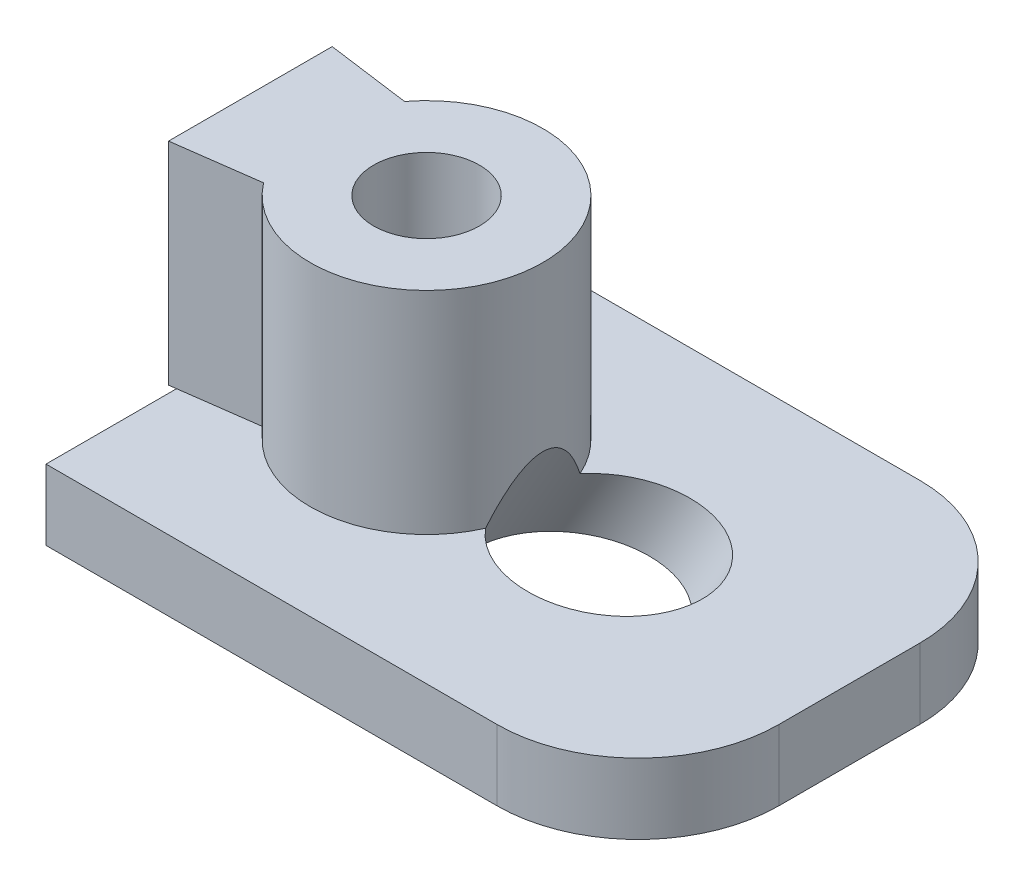
ISO-10303-21;
HEADER;
FILE_DESCRIPTION(('STEP AP214'),'2;1');
FILE_NAME('part.step','',(''),(''),'','','');
FILE_SCHEMA(('AUTOMOTIVE_DESIGN { 1 0 10303 214 1 1 1 1 }'));
ENDSEC;
DATA;
#1=APPLICATION_CONTEXT('core data for automotive mechanical design processes');
#2=APPLICATION_PROTOCOL_DEFINITION('international standard','automotive_design',2000,#1);
#3=PRODUCT_CONTEXT('',#1,'mechanical');
#4=PRODUCT('Part','Part','',(#3));
#5=PRODUCT_RELATED_PRODUCT_CATEGORY('part','',(#4));
#6=PRODUCT_DEFINITION_FORMATION('','',#4);
#7=PRODUCT_DEFINITION_CONTEXT('part definition',#1,'design');
#8=PRODUCT_DEFINITION('design','',#6,#7);
#9=PRODUCT_DEFINITION_SHAPE('','',#8);
#10=(LENGTH_UNIT() NAMED_UNIT(*) SI_UNIT(.MILLI.,.METRE.));
#11=(NAMED_UNIT(*) PLANE_ANGLE_UNIT() SI_UNIT($,.RADIAN.));
#12=(NAMED_UNIT(*) SI_UNIT($,.STERADIAN.) SOLID_ANGLE_UNIT());
#13=UNCERTAINTY_MEASURE_WITH_UNIT(LENGTH_MEASURE(1.E-05),#10,'distance_accuracy_value','');
#14=(GEOMETRIC_REPRESENTATION_CONTEXT(3) GLOBAL_UNCERTAINTY_ASSIGNED_CONTEXT((#13)) GLOBAL_UNIT_ASSIGNED_CONTEXT((#10,
#11,#12)) REPRESENTATION_CONTEXT('',''));
#15=CARTESIAN_POINT('',(0.,0.,0.));
#16=DIRECTION('',(0.,0.,1.));
#17=DIRECTION('',(1.,0.,0.));
#18=AXIS2_PLACEMENT_3D('',#15,#16,#17);
#19=CARTESIAN_POINT('',(2.5,7.75,0.));
#20=DIRECTION('',(0.,1.,0.));
#21=DIRECTION('',(0.,0.,1.));
#22=AXIS2_PLACEMENT_3D('',#19,#20,#21);
#23=PLANE('',#22);
#24=DIRECTION('',(0.,0.,-1.));
#25=VECTOR('',#24,1.);
#26=CARTESIAN_POINT('',(1.30000000001017,7.75,1.49999999996326));
#27=LINE('',#26,#25);
#28=CARTESIAN_POINT('',(1.30000000001017,7.75,0.573731658954848));
#29=VERTEX_POINT('',#28);
#30=CARTESIAN_POINT('',(1.30000000001017,7.75,-0.573731658954847));
#31=VERTEX_POINT('',#30);
#32=EDGE_CURVE('E48',#29,#31,#27,.T.);
#33=ORIENTED_EDGE('',*,*,#32,.F.);
#34=DIRECTION('',(0.990932376959291,0.,-0.134361543210135));
#35=VECTOR('',#34,1.);
#36=CARTESIAN_POINT('',(1.84377976257967,7.75,0.500000000000001));
#37=LINE('',#36,#35);
#38=CARTESIAN_POINT('',(1.25000000001017,7.75,0.580511210533455));
#39=VERTEX_POINT('',#38);
#40=EDGE_CURVE('E158',#39,#29,#37,.T.);
#41=ORIENTED_EDGE('',*,*,#40,.F.);
#42=DIRECTION('',(0.,0.,1.));
#43=VECTOR('',#42,1.);
#44=CARTESIAN_POINT('',(1.25000000001017,7.75,0.580511210533455));
#45=LINE('',#44,#43);
#46=CARTESIAN_POINT('',(1.25000000001017,7.75,-0.580511210533454));
#47=VERTEX_POINT('',#46);
#48=EDGE_CURVE('E155',#47,#39,#45,.T.);
#49=ORIENTED_EDGE('',*,*,#48,.F.);
#50=DIRECTION('',(-0.990932376959291,0.,-0.134361543210137));
#51=VECTOR('',#50,1.);
#52=CARTESIAN_POINT('',(1.25000000001017,7.75,-0.580511210533454));
#53=LINE('',#52,#51);
#54=EDGE_CURVE('E146',#31,#47,#53,.T.);
#55=ORIENTED_EDGE('',*,*,#54,.F.);
#56=EDGE_LOOP('',(#33,#41,#49,#55));
#57=FACE_BOUND('',#56,.T.);
#58=ADVANCED_FACE('F39',(#57),#23,.F.);
#59=CARTESIAN_POINT('',(2.5,9.25,0.));
#60=DIRECTION('',(0.,1.,0.));
#61=DIRECTION('',(0.,0.,1.));
#62=AXIS2_PLACEMENT_3D('',#59,#60,#61);
#63=PLANE('',#62);
#64=CARTESIAN_POINT('',(2.5,9.25,0.));
#65=DIRECTION('',(0.,1.,0.));
#66=DIRECTION('',(0.,0.,1.));
#67=AXIS2_PLACEMENT_3D('',#64,#65,#66);
#68=CIRCLE('',#67,0.824999999999999);
#69=CARTESIAN_POINT('',(1.84377976257967,9.25,0.500000000000001));
#70=VERTEX_POINT('',#69);
#71=CARTESIAN_POINT('',(1.84377976257967,9.25,-0.499999999999999));
#72=VERTEX_POINT('',#71);
#73=EDGE_CURVE('E160',#70,#72,#68,.T.);
#74=ORIENTED_EDGE('',*,*,#73,.T.);
#75=DIRECTION('',(-0.990932376959291,0.,-0.134361543210137));
#76=VECTOR('',#75,1.);
#77=CARTESIAN_POINT('',(1.25000000001017,9.25,-0.580511210533454));
#78=LINE('',#77,#76);
#79=CARTESIAN_POINT('',(1.25000000001017,9.25,-0.580511210533454));
#80=VERTEX_POINT('',#79);
#81=EDGE_CURVE('E295',#72,#80,#78,.T.);
#82=ORIENTED_EDGE('',*,*,#81,.T.);
#83=DIRECTION('',(0.,0.,1.));
#84=VECTOR('',#83,1.);
#85=CARTESIAN_POINT('',(1.25000000001017,9.25,0.580511210533455));
#86=LINE('',#85,#84);
#87=CARTESIAN_POINT('',(1.25000000001017,9.25,0.580511210533455));
#88=VERTEX_POINT('',#87);
#89=EDGE_CURVE('E296',#80,#88,#86,.T.);
#90=ORIENTED_EDGE('',*,*,#89,.T.);
#91=DIRECTION('',(0.990932376959291,0.,-0.134361543210135));
#92=VECTOR('',#91,1.);
#93=CARTESIAN_POINT('',(1.84377976257967,9.25,0.500000000000001));
#94=LINE('',#93,#92);
#95=EDGE_CURVE('E152',#88,#70,#94,.T.);
#96=ORIENTED_EDGE('',*,*,#95,.T.);
#97=EDGE_LOOP('',(#74,#82,#90,#96));
#98=FACE_BOUND('',#97,.T.);
#99=CARTESIAN_POINT('',(2.5,9.25,0.));
#100=DIRECTION('',(0.,1.,0.));
#101=DIRECTION('',(0.,0.,1.));
#102=AXIS2_PLACEMENT_3D('',#99,#100,#101);
#103=CIRCLE('',#102,0.374999999999997);
#104=CARTESIAN_POINT('',(2.5,9.25,0.374999999999998));
#105=VERTEX_POINT('',#104);
#106=EDGE_CURVE('E144',#105,#105,#103,.T.);
#107=ORIENTED_EDGE('',*,*,#106,.F.);
#108=EDGE_LOOP('',(#107));
#109=FACE_BOUND('',#108,.T.);
#110=ADVANCED_FACE('F246',(#98,#109),#63,.T.);
#111=CARTESIAN_POINT('',(2.5,9.25,0.));
#112=DIRECTION('',(0.,-1.,0.));
#113=DIRECTION('',(0.,0.,-1.));
#114=AXIS2_PLACEMENT_3D('',#111,#112,#113);
#115=CYLINDRICAL_SURFACE('',#114,0.824999999999999);
#116=CARTESIAN_POINT('',(2.5,7.75,0.));
#117=DIRECTION('',(0.,1.,0.));
#118=DIRECTION('',(0.,0.,1.));
#119=AXIS2_PLACEMENT_3D('',#116,#117,#118);
#120=CIRCLE('',#119,0.824999999999999);
#121=CARTESIAN_POINT('',(1.84377976257967,7.75,0.500000000000001));
#122=VERTEX_POINT('',#121);
#123=CARTESIAN_POINT('',(3.25386128245776,7.75,0.335139026093854));
#124=VERTEX_POINT('',#123);
#125=EDGE_CURVE('E137',#122,#124,#120,.T.);
#126=ORIENTED_EDGE('',*,*,#125,.T.);
#127=CARTESIAN_POINT('',(3.25386128245776,7.75,0.335139026093854));
#128=CARTESIAN_POINT('',(3.25811827945143,7.77111145134007,0.325541480594741));
#129=CARTESIAN_POINT('',(3.26237618985324,7.79203851414726,0.315490895272771));
#130=CARTESIAN_POINT('',(3.27087060163928,7.83346444112072,0.294143706094102));
#131=CARTESIAN_POINT('',(3.27510666885029,7.85395862240085,0.282837894462469));
#132=CARTESIAN_POINT('',(3.28365867745061,7.89504882720899,0.258226700738959));
#133=CARTESIAN_POINT('',(3.28796923505354,7.91560562627378,0.244852971195866));
#134=CARTESIAN_POINT('',(3.29633558540741,7.95525746882288,0.216100636082207));
#135=CARTESIAN_POINT('',(3.30039223893617,7.97435750521167,0.200729416591836));
#136=CARTESIAN_POINT('',(3.3068811786802,8.00475583811144,0.172365461038509));
#137=CARTESIAN_POINT('',(3.30943325103671,8.01666468819849,0.160062926805976));
#138=CARTESIAN_POINT('',(3.31415936947011,8.03865387144431,0.133955802069157));
#139=CARTESIAN_POINT('',(3.31633608493243,8.04874714052105,0.120163058618312));
#140=CARTESIAN_POINT('',(3.31949670108628,8.06337210909149,0.0956487923371603));
#141=CARTESIAN_POINT('',(3.32063801388451,8.06864369968799,0.0853948313894527));
#142=CARTESIAN_POINT('',(3.32257028030641,8.07755972822864,0.0641595159964622));
#143=CARTESIAN_POINT('',(3.32336147927492,8.0812053056277,0.0531786771391695));
#144=CARTESIAN_POINT('',(3.32451106354808,8.08649985099804,0.0305834067615675));
#145=CARTESIAN_POINT('',(3.32486475076176,8.08812714672857,0.0189634739441499));
#146=CARTESIAN_POINT('',(3.32507075738346,8.08907515740627,-0.00437514955612619));
#147=CARTESIAN_POINT('',(3.32492327601952,8.08839678891716,-0.0160937991488201));
#148=CARTESIAN_POINT('',(3.32420599420556,8.08509483171219,-0.0375262797973913));
#149=CARTESIAN_POINT('',(3.32369887705464,8.08275994627251,-0.0472892373627836));
#150=CARTESIAN_POINT('',(3.32238349803524,8.07669752546358,-0.0663453282431124));
#151=CARTESIAN_POINT('',(3.32157510025383,8.07296936156009,-0.0756382473634516));
#152=CARTESIAN_POINT('',(3.31915992515662,8.06181618546568,-0.0990567266198888));
#153=CARTESIAN_POINT('',(3.31736498722118,8.05351449699766,-0.112742182378179));
#154=CARTESIAN_POINT('',(3.3133685530943,8.03497759042128,-0.138670077205083));
#155=CARTESIAN_POINT('',(3.31116570433568,8.02473593703016,-0.15090748678667));
#156=CARTESIAN_POINT('',(3.30435312281886,7.9929546603496,-0.184834268167634));
#157=CARTESIAN_POINT('',(3.29939752035186,7.96970764985597,-0.204830208753251));
#158=CARTESIAN_POINT('',(3.28906892407751,7.92085898946442,-0.24157132260841));
#159=CARTESIAN_POINT('',(3.28369431237605,7.89524813437457,-0.258302923156063));
#160=CARTESIAN_POINT('',(3.27421193936738,7.84963382590647,-0.285248119484467));
#161=CARTESIAN_POINT('',(3.27014588007999,7.82994285917185,-0.296014031765552));
#162=CARTESIAN_POINT('',(3.26200673466994,7.79022219707945,-0.316365288634048));
#163=CARTESIAN_POINT('',(3.25793414959498,7.77019805751701,-0.325961622383703));
#164=CARTESIAN_POINT('',(3.25386128245776,7.75,-0.335139026093853));
#165=B_SPLINE_CURVE_WITH_KNOTS('',3,(#127,#128,#129,#130,#131,#132,#133,#134,#135,#136,#137,
#138,#139,#140,#141,#142,#143,#144,#145,#146,#147,#148,#149,#150,#151,#152,#153,#154,#155,#156,
#157,#158,#159,#160,#161,#162,#163,#164),.UNSPECIFIED.,.F.,.F.,(4,2,2,2,2,2,2,2,2,2,2,2,2,2,2,2,
2,2,4),(0.,0.0707590786088198,0.142076599835266,0.216696383892076,0.291047707088387,
0.342874159646893,0.394315307428964,0.428961111740479,0.46358259915488,0.498572719615471,
0.533548932186501,0.56357810303105,0.59362083698671,0.641661779813978,0.689864967823453,
0.782531021828784,0.875574521702554,0.943962360776457,1.01164783934957),.UNSPECIFIED.);
#166=CARTESIAN_POINT('',(3.25386128245776,7.75,-0.335139026093853));
#167=VERTEX_POINT('',#166);
#168=EDGE_CURVE('E53',#124,#167,#165,.T.);
#169=ORIENTED_EDGE('',*,*,#168,.T.);
#170=CARTESIAN_POINT('',(1.84377976257967,7.75,-0.499999999999999));
#171=VERTEX_POINT('',#170);
#172=EDGE_CURVE('E134',#167,#171,#120,.T.);
#173=ORIENTED_EDGE('',*,*,#172,.T.);
#174=DIRECTION('',(0.,-1.,0.));
#175=VECTOR('',#174,1.);
#176=CARTESIAN_POINT('',(1.84377976257967,9.25,-0.499999999999999));
#177=LINE('',#176,#175);
#178=EDGE_CURVE('E168',#72,#171,#177,.T.);
#179=ORIENTED_EDGE('',*,*,#178,.F.);
#180=ORIENTED_EDGE('',*,*,#73,.F.);
#181=DIRECTION('',(0.,-1.,0.));
#182=VECTOR('',#181,1.);
#183=CARTESIAN_POINT('',(1.84377976257967,9.25,0.500000000000001));
#184=LINE('',#183,#182);
#185=EDGE_CURVE('E161',#70,#122,#184,.T.);
#186=ORIENTED_EDGE('',*,*,#185,.T.);
#187=EDGE_LOOP('',(#126,#169,#173,#179,#180,#186));
#188=FACE_BOUND('',#187,.T.);
#189=ADVANCED_FACE('F41',(#188),#115,.T.);
#190=CARTESIAN_POINT('',(1.25000000001017,9.25,-0.580511210533454));
#191=DIRECTION('',(-0.134361543210137,0.,0.990932376959291));
#192=DIRECTION('',(0.990932376959291,0.,0.134361543210137));
#193=AXIS2_PLACEMENT_3D('',#190,#191,#192);
#194=PLANE('',#193);
#195=EDGE_CURVE('E143',#171,#31,#53,.T.);
#196=ORIENTED_EDGE('',*,*,#195,.T.);
#197=ORIENTED_EDGE('',*,*,#54,.T.);
#198=DIRECTION('',(0.,-1.,0.));
#199=VECTOR('',#198,1.);
#200=CARTESIAN_POINT('',(1.25000000001017,9.25,-0.580511210533454));
#201=LINE('',#200,#199);
#202=EDGE_CURVE('E166',#80,#47,#201,.T.);
#203=ORIENTED_EDGE('',*,*,#202,.F.);
#204=ORIENTED_EDGE('',*,*,#81,.F.);
#205=ORIENTED_EDGE('',*,*,#178,.T.);
#206=EDGE_LOOP('',(#196,#197,#203,#204,#205));
#207=FACE_BOUND('',#206,.T.);
#208=ADVANCED_FACE('F257',(#207),#194,.F.);
#209=CARTESIAN_POINT('',(1.25000000001017,9.25,0.580511210533455));
#210=DIRECTION('',(1.,0.,0.));
#211=DIRECTION('',(0.,0.,-1.));
#212=AXIS2_PLACEMENT_3D('',#209,#210,#211);
#213=PLANE('',#212);
#214=ORIENTED_EDGE('',*,*,#48,.T.);
#215=DIRECTION('',(0.,-1.,0.));
#216=VECTOR('',#215,1.);
#217=CARTESIAN_POINT('',(1.25000000001017,9.25,0.580511210533455));
#218=LINE('',#217,#216);
#219=EDGE_CURVE('E163',#88,#39,#218,.T.);
#220=ORIENTED_EDGE('',*,*,#219,.F.);
#221=ORIENTED_EDGE('',*,*,#89,.F.);
#222=ORIENTED_EDGE('',*,*,#202,.T.);
#223=EDGE_LOOP('',(#214,#220,#221,#222));
#224=FACE_BOUND('',#223,.T.);
#225=ADVANCED_FACE('F254',(#224),#213,.F.);
#226=CARTESIAN_POINT('',(1.84377976257967,9.25,0.500000000000001));
#227=DIRECTION('',(-0.134361543210135,0.,-0.990932376959291));
#228=DIRECTION('',(-0.990932376959291,0.,0.134361543210135));
#229=AXIS2_PLACEMENT_3D('',#226,#227,#228);
#230=PLANE('',#229);
#231=ORIENTED_EDGE('',*,*,#40,.T.);
#232=EDGE_CURVE('E157',#29,#122,#37,.T.);
#233=ORIENTED_EDGE('',*,*,#232,.T.);
#234=ORIENTED_EDGE('',*,*,#185,.F.);
#235=ORIENTED_EDGE('',*,*,#95,.F.);
#236=ORIENTED_EDGE('',*,*,#219,.T.);
#237=EDGE_LOOP('',(#231,#233,#234,#235,#236));
#238=FACE_BOUND('',#237,.T.);
#239=ADVANCED_FACE('F244',(#238),#230,.F.);
#240=CARTESIAN_POINT('',(2.5,9.25,0.));
#241=DIRECTION('',(0.,-1.,0.));
#242=DIRECTION('',(0.,0.,-1.));
#243=AXIS2_PLACEMENT_3D('',#240,#241,#242);
#244=CYLINDRICAL_SURFACE('',#243,0.374999999999997);
#245=ORIENTED_EDGE('',*,*,#106,.T.);
#246=EDGE_LOOP('',(#245));
#247=FACE_BOUND('',#246,.T.);
#248=CARTESIAN_POINT('',(2.5,7.75,0.));
#249=DIRECTION('',(0.,1.,0.));
#250=DIRECTION('',(0.,0.,1.));
#251=AXIS2_PLACEMENT_3D('',#248,#249,#250);
#252=CIRCLE('',#251,0.374999999999997);
#253=CARTESIAN_POINT('',(2.5,7.75,0.374999999999998));
#254=VERTEX_POINT('',#253);
#255=EDGE_CURVE('E148',#254,#254,#252,.T.);
#256=ORIENTED_EDGE('',*,*,#255,.F.);
#257=EDGE_LOOP('',(#256));
#258=FACE_BOUND('',#257,.T.);
#259=ADVANCED_FACE('F216',(#247,#258),#244,.F.);
#260=CARTESIAN_POINT('',(4.50000000001019,7.25,0.499999999963261));
#261=DIRECTION('',(0.,1.,0.));
#262=DIRECTION('',(-1.,0.,0.));
#263=AXIS2_PLACEMENT_3D('',#260,#261,#262);
#264=PLANE('',#263);
#265=CARTESIAN_POINT('',(3.50470053838943,7.25,0.));
#266=DIRECTION('',(0.,1.,0.));
#267=DIRECTION('',(1.,0.,0.));
#268=AXIS2_PLACEMENT_3D('',#265,#266,#267);
#269=ELLIPSE('',#268,0.663952809568066,0.575);
#270=CARTESIAN_POINT('',(4.16865334795749,7.25,0.));
#271=VERTEX_POINT('',#270);
#272=EDGE_CURVE('E138',#271,#271,#269,.T.);
#273=ORIENTED_EDGE('',*,*,#272,.T.);
#274=EDGE_LOOP('',(#273));
#275=FACE_BOUND('',#274,.T.);
#276=DIRECTION('',(-1.,0.,0.));
#277=VECTOR('',#276,1.);
#278=CARTESIAN_POINT('',(1.30000000001017,7.25,1.49999999996326));
#279=LINE('',#278,#277);
#280=CARTESIAN_POINT('',(4.50000000001019,7.25,1.49999999996326));
#281=VERTEX_POINT('',#280);
#282=CARTESIAN_POINT('',(1.30000000001017,7.25,1.49999999996326));
#283=VERTEX_POINT('',#282);
#284=EDGE_CURVE('E200',#281,#283,#279,.T.);
#285=ORIENTED_EDGE('',*,*,#284,.T.);
#286=DIRECTION('',(0.,0.,-1.));
#287=VECTOR('',#286,1.);
#288=CARTESIAN_POINT('',(1.30000000001017,7.25,1.49999999996326));
#289=LINE('',#288,#287);
#290=CARTESIAN_POINT('',(1.30000000001017,7.25,-1.50000000003674));
#291=VERTEX_POINT('',#290);
#292=EDGE_CURVE('E198',#283,#291,#289,.T.);
#293=ORIENTED_EDGE('',*,*,#292,.T.);
#294=DIRECTION('',(1.,0.,0.));
#295=VECTOR('',#294,1.);
#296=CARTESIAN_POINT('',(4.50000000001019,7.25,-1.50000000003674));
#297=LINE('',#296,#295);
#298=CARTESIAN_POINT('',(4.50000000001019,7.25,-1.50000000003674));
#299=VERTEX_POINT('',#298);
#300=EDGE_CURVE('E196',#291,#299,#297,.T.);
#301=ORIENTED_EDGE('',*,*,#300,.T.);
#302=CARTESIAN_POINT('',(4.50000000001019,7.25,-0.500000000036739));
#303=DIRECTION('',(0.,-1.,0.));
#304=DIRECTION('',(-1.,0.,0.));
#305=AXIS2_PLACEMENT_3D('',#302,#303,#304);
#306=CIRCLE('',#305,1.);
#307=CARTESIAN_POINT('',(5.50000000001019,7.25,-0.500000000036739));
#308=VERTEX_POINT('',#307);
#309=EDGE_CURVE('E194',#299,#308,#306,.T.);
#310=ORIENTED_EDGE('',*,*,#309,.T.);
#311=DIRECTION('',(0.,0.,1.));
#312=VECTOR('',#311,1.);
#313=CARTESIAN_POINT('',(5.50000000001019,7.25,0.499999999963261));
#314=LINE('',#313,#312);
#315=CARTESIAN_POINT('',(5.50000000001019,7.25,0.499999999963261));
#316=VERTEX_POINT('',#315);
#317=EDGE_CURVE('E192',#308,#316,#314,.T.);
#318=ORIENTED_EDGE('',*,*,#317,.T.);
#319=CARTESIAN_POINT('',(4.50000000001019,7.25,0.499999999963261));
#320=DIRECTION('',(0.,-1.,0.));
#321=DIRECTION('',(-1.,0.,0.));
#322=AXIS2_PLACEMENT_3D('',#319,#320,#321);
#323=CIRCLE('',#322,1.);
#324=EDGE_CURVE('E189',#316,#281,#323,.T.);
#325=ORIENTED_EDGE('',*,*,#324,.T.);
#326=EDGE_LOOP('',(#285,#293,#301,#310,#318,#325));
#327=FACE_BOUND('',#326,.T.);
#328=ADVANCED_FACE('F212',(#275,#327),#264,.F.);
#329=CARTESIAN_POINT('',(4.50000000001019,7.25,0.499999999963261));
#330=DIRECTION('',(0.,1.,0.));
#331=DIRECTION('',(-1.,0.,0.));
#332=AXIS2_PLACEMENT_3D('',#329,#330,#331);
#333=CYLINDRICAL_SURFACE('',#332,1.);
#334=CARTESIAN_POINT('',(4.50000000001019,7.75,0.499999999963261));
#335=DIRECTION('',(0.,-1.,0.));
#336=DIRECTION('',(-1.,0.,0.));
#337=AXIS2_PLACEMENT_3D('',#334,#335,#336);
#338=CIRCLE('',#337,1.);
#339=CARTESIAN_POINT('',(5.50000000001019,7.75,0.499999999963261));
#340=VERTEX_POINT('',#339);
#341=CARTESIAN_POINT('',(4.50000000001019,7.75,1.49999999996326));
#342=VERTEX_POINT('',#341);
#343=EDGE_CURVE('E202',#340,#342,#338,.T.);
#344=ORIENTED_EDGE('',*,*,#343,.T.);
#345=DIRECTION('',(0.,1.,0.));
#346=VECTOR('',#345,1.);
#347=CARTESIAN_POINT('',(4.50000000001019,7.25,1.49999999996326));
#348=LINE('',#347,#346);
#349=EDGE_CURVE('E191',#281,#342,#348,.T.);
#350=ORIENTED_EDGE('',*,*,#349,.F.);
#351=ORIENTED_EDGE('',*,*,#324,.F.);
#352=DIRECTION('',(0.,1.,0.));
#353=VECTOR('',#352,1.);
#354=CARTESIAN_POINT('',(5.50000000001019,7.25,0.499999999963261));
#355=LINE('',#354,#353);
#356=EDGE_CURVE('E278',#316,#340,#355,.T.);
#357=ORIENTED_EDGE('',*,*,#356,.T.);
#358=EDGE_LOOP('',(#344,#350,#351,#357));
#359=FACE_BOUND('',#358,.T.);
#360=ADVANCED_FACE('F215',(#359),#333,.T.);
#361=CARTESIAN_POINT('',(5.50000000001019,7.25,0.499999999963261));
#362=DIRECTION('',(-1.,0.,0.));
#363=DIRECTION('',(0.,-1.,0.));
#364=AXIS2_PLACEMENT_3D('',#361,#362,#363);
#365=PLANE('',#364);
#366=DIRECTION('',(0.,0.,1.));
#367=VECTOR('',#366,1.);
#368=CARTESIAN_POINT('',(5.50000000001019,7.75,0.499999999963261));
#369=LINE('',#368,#367);
#370=CARTESIAN_POINT('',(5.50000000001019,7.75,-0.500000000036739));
#371=VERTEX_POINT('',#370);
#372=EDGE_CURVE('E272',#371,#340,#369,.T.);
#373=ORIENTED_EDGE('',*,*,#372,.T.);
#374=ORIENTED_EDGE('',*,*,#356,.F.);
#375=ORIENTED_EDGE('',*,*,#317,.F.);
#376=DIRECTION('',(0.,1.,0.));
#377=VECTOR('',#376,1.);
#378=CARTESIAN_POINT('',(5.50000000001019,7.25,-0.500000000036739));
#379=LINE('',#378,#377);
#380=EDGE_CURVE('E281',#308,#371,#379,.T.);
#381=ORIENTED_EDGE('',*,*,#380,.T.);
#382=EDGE_LOOP('',(#373,#374,#375,#381));
#383=FACE_BOUND('',#382,.T.);
#384=ADVANCED_FACE('F223',(#383),#365,.F.);
#385=CARTESIAN_POINT('',(4.50000000001019,7.25,-0.500000000036739));
#386=DIRECTION('',(0.,1.,0.));
#387=DIRECTION('',(-1.,0.,0.));
#388=AXIS2_PLACEMENT_3D('',#385,#386,#387);
#389=CYLINDRICAL_SURFACE('',#388,1.);
#390=CARTESIAN_POINT('',(4.50000000001019,7.75,-0.500000000036739));
#391=DIRECTION('',(0.,-1.,0.));
#392=DIRECTION('',(-1.,0.,0.));
#393=AXIS2_PLACEMENT_3D('',#390,#391,#392);
#394=CIRCLE('',#393,1.);
#395=CARTESIAN_POINT('',(4.50000000001019,7.75,-1.50000000003674));
#396=VERTEX_POINT('',#395);
#397=EDGE_CURVE('E269',#396,#371,#394,.T.);
#398=ORIENTED_EDGE('',*,*,#397,.T.);
#399=ORIENTED_EDGE('',*,*,#380,.F.);
#400=ORIENTED_EDGE('',*,*,#309,.F.);
#401=DIRECTION('',(0.,1.,0.));
#402=VECTOR('',#401,1.);
#403=CARTESIAN_POINT('',(4.50000000001019,7.25,-1.50000000003674));
#404=LINE('',#403,#402);
#405=EDGE_CURVE('E284',#299,#396,#404,.T.);
#406=ORIENTED_EDGE('',*,*,#405,.T.);
#407=EDGE_LOOP('',(#398,#399,#400,#406));
#408=FACE_BOUND('',#407,.T.);
#409=ADVANCED_FACE('F227',(#408),#389,.T.);
#410=CARTESIAN_POINT('',(4.50000000001019,7.25,-1.50000000003674));
#411=DIRECTION('',(0.,0.,1.));
#412=DIRECTION('',(1.,0.,0.));
#413=AXIS2_PLACEMENT_3D('',#410,#411,#412);
#414=PLANE('',#413);
#415=DIRECTION('',(1.,0.,0.));
#416=VECTOR('',#415,1.);
#417=CARTESIAN_POINT('',(4.50000000001019,7.75,-1.50000000003674));
#418=LINE('',#417,#416);
#419=CARTESIAN_POINT('',(1.30000000001017,7.75,-1.50000000003674));
#420=VERTEX_POINT('',#419);
#421=EDGE_CURVE('E177',#420,#396,#418,.T.);
#422=ORIENTED_EDGE('',*,*,#421,.T.);
#423=ORIENTED_EDGE('',*,*,#405,.F.);
#424=ORIENTED_EDGE('',*,*,#300,.F.);
#425=DIRECTION('',(0.,1.,0.));
#426=VECTOR('',#425,1.);
#427=CARTESIAN_POINT('',(1.30000000001017,7.25,-1.50000000003674));
#428=LINE('',#427,#426);
#429=EDGE_CURVE('E286',#291,#420,#428,.T.);
#430=ORIENTED_EDGE('',*,*,#429,.T.);
#431=EDGE_LOOP('',(#422,#423,#424,#430));
#432=FACE_BOUND('',#431,.T.);
#433=ADVANCED_FACE('F231',(#432),#414,.F.);
#434=CARTESIAN_POINT('',(1.30000000001017,7.25,1.49999999996326));
#435=DIRECTION('',(1.,0.,0.));
#436=DIRECTION('',(0.,0.,-1.));
#437=AXIS2_PLACEMENT_3D('',#434,#435,#436);
#438=PLANE('',#437);
#439=CARTESIAN_POINT('',(1.30000000001017,7.75,1.49999999996326));
#440=VERTEX_POINT('',#439);
#441=EDGE_CURVE('E171',#440,#29,#27,.T.);
#442=ORIENTED_EDGE('',*,*,#441,.T.);
#443=ORIENTED_EDGE('',*,*,#32,.T.);
#444=EDGE_CURVE('E172',#31,#420,#27,.T.);
#445=ORIENTED_EDGE('',*,*,#444,.T.);
#446=ORIENTED_EDGE('',*,*,#429,.F.);
#447=ORIENTED_EDGE('',*,*,#292,.F.);
#448=DIRECTION('',(0.,1.,0.));
#449=VECTOR('',#448,1.);
#450=CARTESIAN_POINT('',(1.30000000001017,7.25,1.49999999996326));
#451=LINE('',#450,#449);
#452=EDGE_CURVE('E288',#283,#440,#451,.T.);
#453=ORIENTED_EDGE('',*,*,#452,.T.);
#454=EDGE_LOOP('',(#442,#443,#445,#446,#447,#453));
#455=FACE_BOUND('',#454,.T.);
#456=ADVANCED_FACE('F235',(#455),#438,.F.);
#457=CARTESIAN_POINT('',(1.30000000001017,7.25,1.49999999996326));
#458=DIRECTION('',(0.,0.,-1.));
#459=DIRECTION('',(0.,1.,0.));
#460=AXIS2_PLACEMENT_3D('',#457,#458,#459);
#461=PLANE('',#460);
#462=DIRECTION('',(-1.,0.,0.));
#463=VECTOR('',#462,1.);
#464=CARTESIAN_POINT('',(1.30000000001017,7.75,1.49999999996326));
#465=LINE('',#464,#463);
#466=EDGE_CURVE('E178',#342,#440,#465,.T.);
#467=ORIENTED_EDGE('',*,*,#466,.T.);
#468=ORIENTED_EDGE('',*,*,#452,.F.);
#469=ORIENTED_EDGE('',*,*,#284,.F.);
#470=ORIENTED_EDGE('',*,*,#349,.T.);
#471=EDGE_LOOP('',(#467,#468,#469,#470));
#472=FACE_BOUND('',#471,.T.);
#473=ADVANCED_FACE('F239',(#472),#461,.F.);
#474=CARTESIAN_POINT('',(4.50000000001019,7.75,0.499999999963261));
#475=DIRECTION('',(0.,1.,0.));
#476=DIRECTION('',(-1.,0.,0.));
#477=AXIS2_PLACEMENT_3D('',#474,#475,#476);
#478=PLANE('',#477);
#479=CARTESIAN_POINT('',(3.79337567298423,7.75,0.));
#480=DIRECTION('',(0.,1.,0.));
#481=DIRECTION('',(1.,0.,0.));
#482=AXIS2_PLACEMENT_3D('',#479,#480,#481);
#483=ELLIPSE('',#482,0.663952809568066,0.575);
#484=EDGE_CURVE('E11',#124,#167,#483,.T.);
#485=ORIENTED_EDGE('',*,*,#484,.F.);
#486=ORIENTED_EDGE('',*,*,#125,.F.);
#487=ORIENTED_EDGE('',*,*,#232,.F.);
#488=ORIENTED_EDGE('',*,*,#441,.F.);
#489=ORIENTED_EDGE('',*,*,#466,.F.);
#490=ORIENTED_EDGE('',*,*,#343,.F.);
#491=ORIENTED_EDGE('',*,*,#372,.F.);
#492=ORIENTED_EDGE('',*,*,#397,.F.);
#493=ORIENTED_EDGE('',*,*,#421,.F.);
#494=ORIENTED_EDGE('',*,*,#444,.F.);
#495=ORIENTED_EDGE('',*,*,#195,.F.);
#496=ORIENTED_EDGE('',*,*,#172,.F.);
#497=EDGE_LOOP('',(#485,#486,#487,#488,#489,#490,#491,#492,#493,#494,#495,#496));
#498=FACE_BOUND('',#497,.T.);
#499=ADVANCED_FACE('F141',(#498),#478,.T.);
#500=ORIENTED_EDGE('',*,*,#255,.T.);
#501=EDGE_LOOP('',(#500));
#502=FACE_BOUND('',#501,.T.);
#503=ADVANCED_FACE('F211',(#502),#478,.T.);
#504=CARTESIAN_POINT('',(2.0750000000102,4.77368602791855,0.));
#505=DIRECTION('',(0.499999999999993,0.866025403784443,0.));
#506=DIRECTION('',(-0.866025403784443,0.499999999999993,0.));
#507=AXIS2_PLACEMENT_3D('',#504,#505,#506);
#508=CYLINDRICAL_SURFACE('',#507,0.575);
#509=ORIENTED_EDGE('',*,*,#484,.T.);
#510=ORIENTED_EDGE('',*,*,#168,.F.);
#511=EDGE_LOOP('',(#509,#510));
#512=FACE_BOUND('',#511,.T.);
#513=ORIENTED_EDGE('',*,*,#272,.F.);
#514=EDGE_LOOP('',(#513));
#515=FACE_BOUND('',#514,.T.);
#516=ADVANCED_FACE('F126',(#512,#515),#508,.F.);
#517=CLOSED_SHELL('',(#58,#110,#189,#208,#225,#239,#259,#328,#360,#384,#409,#433,#456,#473,#499,
#503,#516));
#518=MANIFOLD_SOLID_BREP('B2',#517);
#519=ADVANCED_BREP_SHAPE_REPRESENTATION('',(#18,#518),#14);
#520=SHAPE_DEFINITION_REPRESENTATION(#9,#519);
ENDSEC;
END-ISO-10303-21;
